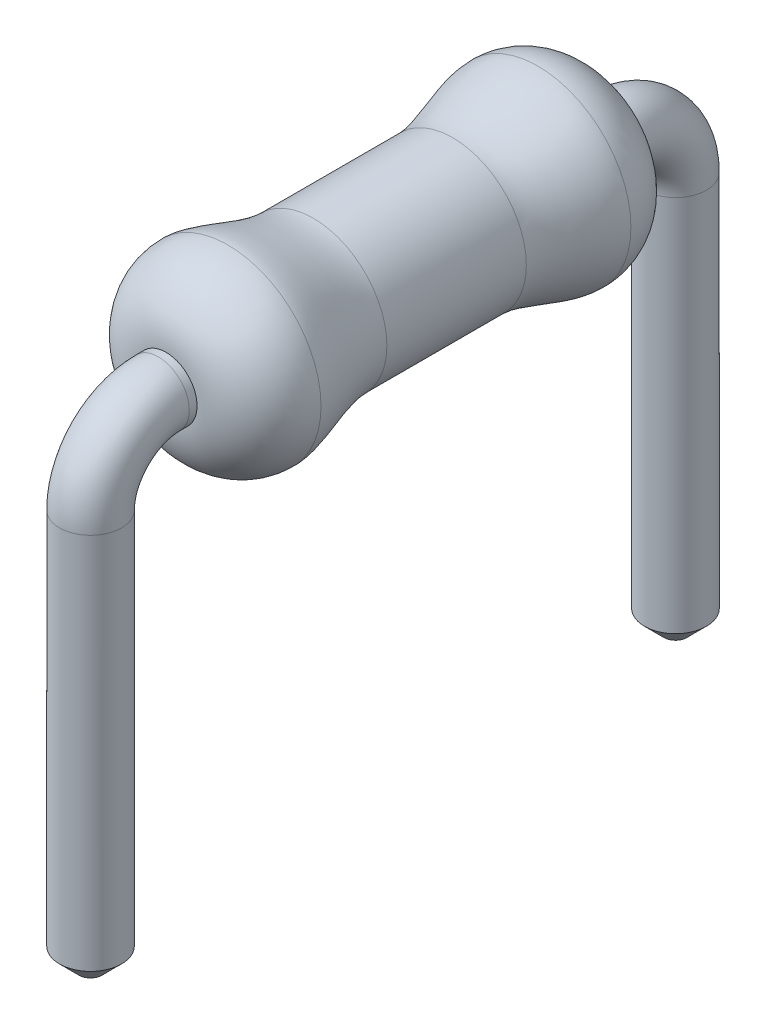
ISO-10303-21;
HEADER;
FILE_DESCRIPTION(('STEP AP214'),'2;1');
FILE_NAME('part.step','',(''),(''),'','','');
FILE_SCHEMA(('AUTOMOTIVE_DESIGN { 1 0 10303 214 1 1 1 1 }'));
ENDSEC;
DATA;
#1=APPLICATION_CONTEXT('core data for automotive mechanical design processes');
#2=APPLICATION_PROTOCOL_DEFINITION('international standard','automotive_design',2000,#1);
#3=PRODUCT_CONTEXT('',#1,'mechanical');
#4=PRODUCT('Part','Part','',(#3));
#5=PRODUCT_RELATED_PRODUCT_CATEGORY('part','',(#4));
#6=PRODUCT_DEFINITION_FORMATION('','',#4);
#7=PRODUCT_DEFINITION_CONTEXT('part definition',#1,'design');
#8=PRODUCT_DEFINITION('design','',#6,#7);
#9=PRODUCT_DEFINITION_SHAPE('','',#8);
#10=(LENGTH_UNIT() NAMED_UNIT(*) SI_UNIT(.MILLI.,.METRE.));
#11=(NAMED_UNIT(*) PLANE_ANGLE_UNIT() SI_UNIT($,.RADIAN.));
#12=(NAMED_UNIT(*) SI_UNIT($,.STERADIAN.) SOLID_ANGLE_UNIT());
#13=UNCERTAINTY_MEASURE_WITH_UNIT(LENGTH_MEASURE(1.E-05),#10,'distance_accuracy_value','');
#14=(GEOMETRIC_REPRESENTATION_CONTEXT(3) GLOBAL_UNCERTAINTY_ASSIGNED_CONTEXT((#13)) GLOBAL_UNIT_ASSIGNED_CONTEXT((#10,
#11,#12)) REPRESENTATION_CONTEXT('',''));
#15=CARTESIAN_POINT('',(0.,0.,0.));
#16=DIRECTION('',(0.,0.,1.));
#17=DIRECTION('',(1.,0.,0.));
#18=AXIS2_PLACEMENT_3D('',#15,#16,#17);
#19=CARTESIAN_POINT('',(0.,3.,-2.));
#20=DIRECTION('',(0.,0.,1.));
#21=DIRECTION('',(1.,0.,0.));
#22=AXIS2_PLACEMENT_3D('',#19,#20,#21);
#23=DEGENERATE_TOROIDAL_SURFACE('',#22,0.4,0.8,.T.);
#24=CARTESIAN_POINT('',(0.,3.,-2.));
#25=DIRECTION('',(0.,0.,1.));
#26=DIRECTION('',(1.,0.,0.));
#27=AXIS2_PLACEMENT_3D('',#24,#25,#26);
#28=CIRCLE('',#27,1.2);
#29=CARTESIAN_POINT('',(1.2,3.,-2.));
#30=VERTEX_POINT('',#29);
#31=EDGE_CURVE('E11',#30,#30,#28,.T.);
#32=ORIENTED_EDGE('',*,*,#31,.F.);
#33=EDGE_LOOP('',(#32));
#34=FACE_BOUND('',#33,.T.);
#35=CARTESIAN_POINT('',(0.,3.,-2.8));
#36=DIRECTION('',(0.,0.,1.));
#37=DIRECTION('',(1.,0.,0.));
#38=AXIS2_PLACEMENT_3D('',#35,#36,#37);
#39=CIRCLE('',#38,0.4);
#40=CARTESIAN_POINT('',(0.4,3.,-2.8));
#41=VERTEX_POINT('',#40);
#42=EDGE_CURVE('E65',#41,#41,#39,.T.);
#43=ORIENTED_EDGE('',*,*,#42,.T.);
#44=EDGE_LOOP('',(#43));
#45=FACE_BOUND('',#44,.T.);
#46=ADVANCED_FACE('F43',(#34,#45),#23,.T.);
#47=CARTESIAN_POINT('',(0.,4.2,-2.));
#48=CARTESIAN_POINT('',(0.,4.2,-1.67748928550892));
#49=CARTESIAN_POINT('',(0.,3.95,-1.22975760115089));
#50=CARTESIAN_POINT('',(0.,3.95,-0.9));
#51=B_SPLINE_CURVE_WITH_KNOTS('',3,(#47,#48,#49,#50),.UNSPECIFIED.,.F.,.F.,(4,4),(0.,1.),.UNSPECIFIED.);
#52=CARTESIAN_POINT('',(0.,3.,5.5081016462708));
#53=DIRECTION('',(0.,0.,1.));
#54=AXIS1_PLACEMENT('',#52,#53);
#55=SURFACE_OF_REVOLUTION('',#51,#54);
#56=CARTESIAN_POINT('',(0.,3.,-0.9));
#57=DIRECTION('',(0.,0.,1.));
#58=DIRECTION('',(1.,0.,0.));
#59=AXIS2_PLACEMENT_3D('',#56,#57,#58);
#60=CIRCLE('',#59,0.95);
#61=CARTESIAN_POINT('',(0.95,3.,-0.9));
#62=VERTEX_POINT('',#61);
#63=EDGE_CURVE('E49',#62,#62,#60,.T.);
#64=ORIENTED_EDGE('',*,*,#63,.F.);
#65=EDGE_LOOP('',(#64));
#66=FACE_BOUND('',#65,.T.);
#67=ORIENTED_EDGE('',*,*,#31,.T.);
#68=EDGE_LOOP('',(#67));
#69=FACE_BOUND('',#68,.T.);
#70=ADVANCED_FACE('F88',(#66,#69),#55,.T.);
#71=CARTESIAN_POINT('',(0.,3.,5.5081016462708));
#72=DIRECTION('',(0.,0.,1.));
#73=DIRECTION('',(1.,0.,0.));
#74=AXIS2_PLACEMENT_3D('',#71,#72,#73);
#75=CYLINDRICAL_SURFACE('',#74,0.95);
#76=CARTESIAN_POINT('',(0.,3.,0.9));
#77=DIRECTION('',(0.,0.,1.));
#78=DIRECTION('',(1.,0.,0.));
#79=AXIS2_PLACEMENT_3D('',#76,#77,#78);
#80=CIRCLE('',#79,0.95);
#81=CARTESIAN_POINT('',(0.95,3.,0.9));
#82=VERTEX_POINT('',#81);
#83=EDGE_CURVE('E53',#82,#82,#80,.T.);
#84=ORIENTED_EDGE('',*,*,#83,.F.);
#85=EDGE_LOOP('',(#84));
#86=FACE_BOUND('',#85,.T.);
#87=ORIENTED_EDGE('',*,*,#63,.T.);
#88=EDGE_LOOP('',(#87));
#89=FACE_BOUND('',#88,.T.);
#90=ADVANCED_FACE('F84',(#86,#89),#75,.T.);
#91=CARTESIAN_POINT('',(0.,3.95,0.9));
#92=CARTESIAN_POINT('',(0.,3.95,1.27989742926156));
#93=CARTESIAN_POINT('',(0.,4.2,1.73855323777111));
#94=CARTESIAN_POINT('',(0.,4.2,2.));
#95=B_SPLINE_CURVE_WITH_KNOTS('',3,(#91,#92,#93,#94),.UNSPECIFIED.,.F.,.F.,(4,4),(0.,1.),.UNSPECIFIED.);
#96=CARTESIAN_POINT('',(0.,3.,5.5081016462708));
#97=DIRECTION('',(0.,0.,1.));
#98=AXIS1_PLACEMENT('',#96,#97);
#99=SURFACE_OF_REVOLUTION('',#95,#98);
#100=CARTESIAN_POINT('',(0.,3.,2.));
#101=DIRECTION('',(0.,0.,1.));
#102=DIRECTION('',(1.,0.,0.));
#103=AXIS2_PLACEMENT_3D('',#100,#101,#102);
#104=CIRCLE('',#103,1.2);
#105=CARTESIAN_POINT('',(1.2,3.,2.));
#106=VERTEX_POINT('',#105);
#107=EDGE_CURVE('E57',#106,#106,#104,.T.);
#108=ORIENTED_EDGE('',*,*,#107,.F.);
#109=EDGE_LOOP('',(#108));
#110=FACE_BOUND('',#109,.T.);
#111=ORIENTED_EDGE('',*,*,#83,.T.);
#112=EDGE_LOOP('',(#111));
#113=FACE_BOUND('',#112,.T.);
#114=ADVANCED_FACE('F79',(#110,#113),#99,.T.);
#115=CARTESIAN_POINT('',(0.,3.,2.));
#116=DIRECTION('',(0.,0.,1.));
#117=DIRECTION('',(1.,0.,0.));
#118=AXIS2_PLACEMENT_3D('',#115,#116,#117);
#119=DEGENERATE_TOROIDAL_SURFACE('',#118,0.4,0.8,.T.);
#120=CARTESIAN_POINT('',(0.,3.,2.8));
#121=DIRECTION('',(0.,0.,1.));
#122=DIRECTION('',(1.,0.,0.));
#123=AXIS2_PLACEMENT_3D('',#120,#121,#122);
#124=CIRCLE('',#123,0.4);
#125=CARTESIAN_POINT('',(0.4,3.,2.8));
#126=VERTEX_POINT('',#125);
#127=EDGE_CURVE('E62',#126,#126,#124,.T.);
#128=ORIENTED_EDGE('',*,*,#127,.F.);
#129=EDGE_LOOP('',(#128));
#130=FACE_BOUND('',#129,.T.);
#131=ORIENTED_EDGE('',*,*,#107,.T.);
#132=EDGE_LOOP('',(#131));
#133=FACE_BOUND('',#132,.T.);
#134=ADVANCED_FACE('F83',(#130,#133),#119,.T.);
#135=CARTESIAN_POINT('',(0.,3.,5.5081016462708));
#136=DIRECTION('',(0.,0.,1.));
#137=DIRECTION('',(1.,0.,0.));
#138=AXIS2_PLACEMENT_3D('',#135,#136,#137);
#139=CYLINDRICAL_SURFACE('',#138,0.4);
#140=ORIENTED_EDGE('',*,*,#42,.F.);
#141=EDGE_LOOP('',(#140));
#142=FACE_BOUND('',#141,.T.);
#143=ORIENTED_EDGE('',*,*,#127,.T.);
#144=EDGE_LOOP('',(#143));
#145=FACE_BOUND('',#144,.T.);
#146=ADVANCED_FACE('F101',(#142,#145),#139,.F.);
#147=CLOSED_SHELL('',(#46,#70,#90,#114,#134,#146));
#148=MANIFOLD_SOLID_BREP('B2',#147);
#149=CARTESIAN_POINT('',(0.,-3.,-3.775));
#150=DIRECTION('',(0.,1.,0.));
#151=DIRECTION('',(0.,0.,1.));
#152=AXIS2_PLACEMENT_3D('',#149,#150,#151);
#153=PLANE('',#152);
#154=CARTESIAN_POINT('',(0.,-3.,-3.775));
#155=DIRECTION('',(0.,1.,0.));
#156=DIRECTION('',(0.,0.,1.));
#157=AXIS2_PLACEMENT_3D('',#154,#155,#156);
#158=CIRCLE('',#157,0.149999999999999);
#159=CARTESIAN_POINT('',(0.,-3.,-3.625));
#160=VERTEX_POINT('',#159);
#161=EDGE_CURVE('E160',#160,#160,#158,.F.);
#162=ORIENTED_EDGE('',*,*,#161,.T.);
#163=EDGE_LOOP('',(#162));
#164=FACE_BOUND('',#163,.T.);
#165=ADVANCED_FACE('F149',(#164),#153,.F.);
#166=CARTESIAN_POINT('',(0.,-3.,3.775));
#167=DIRECTION('',(0.,-1.,0.));
#168=DIRECTION('',(0.,0.,-1.));
#169=AXIS2_PLACEMENT_3D('',#166,#167,#168);
#170=PLANE('',#169);
#171=CARTESIAN_POINT('',(0.,-3.,3.775));
#172=DIRECTION('',(0.,-1.,0.));
#173=DIRECTION('',(0.,0.,-1.));
#174=AXIS2_PLACEMENT_3D('',#171,#172,#173);
#175=CIRCLE('',#174,0.150000000000003);
#176=CARTESIAN_POINT('',(0.,-3.,3.625));
#177=VERTEX_POINT('',#176);
#178=EDGE_CURVE('E156',#177,#177,#175,.T.);
#179=ORIENTED_EDGE('',*,*,#178,.T.);
#180=EDGE_LOOP('',(#179));
#181=FACE_BOUND('',#180,.T.);
#182=ADVANCED_FACE('F186',(#181),#170,.T.);
#183=CARTESIAN_POINT('',(0.,-3.,-3.775));
#184=DIRECTION('',(0.,1.,0.));
#185=DIRECTION('',(0.,0.,1.));
#186=AXIS2_PLACEMENT_3D('',#183,#184,#185);
#187=CYLINDRICAL_SURFACE('',#186,0.4);
#188=CARTESIAN_POINT('',(0.,-2.75,-3.775));
#189=DIRECTION('',(0.,1.,0.));
#190=DIRECTION('',(0.,0.,1.));
#191=AXIS2_PLACEMENT_3D('',#188,#189,#190);
#192=CIRCLE('',#191,0.4);
#193=CARTESIAN_POINT('',(0.,-2.75,-3.375));
#194=VERTEX_POINT('',#193);
#195=EDGE_CURVE('E164',#194,#194,#192,.T.);
#196=ORIENTED_EDGE('',*,*,#195,.T.);
#197=EDGE_LOOP('',(#196));
#198=FACE_BOUND('',#197,.T.);
#199=CARTESIAN_POINT('',(0.,2.125,-3.775));
#200=DIRECTION('',(0.,1.,0.));
#201=DIRECTION('',(0.,0.,1.));
#202=AXIS2_PLACEMENT_3D('',#199,#200,#201);
#203=CIRCLE('',#202,0.4);
#204=CARTESIAN_POINT('',(0.,2.125,-4.175));
#205=VERTEX_POINT('',#204);
#206=EDGE_CURVE('E178',#205,#205,#203,.T.);
#207=ORIENTED_EDGE('',*,*,#206,.F.);
#208=EDGE_LOOP('',(#207));
#209=FACE_BOUND('',#208,.T.);
#210=ADVANCED_FACE('F184',(#198,#209),#187,.T.);
#211=CARTESIAN_POINT('',(0.,2.125,-2.9));
#212=DIRECTION('',(1.,0.,0.));
#213=DIRECTION('',(0.,0.,-1.));
#214=AXIS2_PLACEMENT_3D('',#211,#212,#213);
#215=TOROIDAL_SURFACE('',#214,0.875,0.4);
#216=CARTESIAN_POINT('',(0.,3.,-2.9));
#217=DIRECTION('',(0.,0.,1.));
#218=DIRECTION('',(0.,-1.,0.));
#219=AXIS2_PLACEMENT_3D('',#216,#217,#218);
#220=CIRCLE('',#219,0.4);
#221=CARTESIAN_POINT('',(0.,3.4,-2.9));
#222=VERTEX_POINT('',#221);
#223=EDGE_CURVE('E175',#222,#222,#220,.T.);
#224=CARTESIAN_POINT('',(0.,2.125,-2.9));
#225=DIRECTION('',(1.,0.,0.));
#226=DIRECTION('',(0.,0.,-1.));
#227=AXIS2_PLACEMENT_3D('',#224,#225,#226);
#228=CIRCLE('',#227,1.275);
#229=EDGE_CURVE('',#205,#222,#228,.T.);
#230=ORIENTED_EDGE('',*,*,#206,.T.);
#231=ORIENTED_EDGE('',*,*,#223,.F.);
#232=ORIENTED_EDGE('',*,*,#229,.T.);
#233=ORIENTED_EDGE('',*,*,#229,.F.);
#234=EDGE_LOOP('',(#230,#232,#231,#233));
#235=FACE_BOUND('',#234,.T.);
#236=ADVANCED_FACE('F182',(#235),#215,.T.);
#237=CARTESIAN_POINT('',(0.,3.,-2.9));
#238=DIRECTION('',(0.,0.,1.));
#239=DIRECTION('',(1.,0.,0.));
#240=AXIS2_PLACEMENT_3D('',#237,#238,#239);
#241=CYLINDRICAL_SURFACE('',#240,0.4);
#242=CARTESIAN_POINT('',(0.,3.,2.9));
#243=DIRECTION('',(0.,0.,1.));
#244=DIRECTION('',(0.,-1.,0.));
#245=AXIS2_PLACEMENT_3D('',#242,#243,#244);
#246=CIRCLE('',#245,0.4);
#247=CARTESIAN_POINT('',(0.,3.4,2.9));
#248=VERTEX_POINT('',#247);
#249=EDGE_CURVE('E172',#248,#248,#246,.T.);
#250=ORIENTED_EDGE('',*,*,#249,.F.);
#251=EDGE_LOOP('',(#250));
#252=FACE_BOUND('',#251,.T.);
#253=ORIENTED_EDGE('',*,*,#223,.T.);
#254=EDGE_LOOP('',(#253));
#255=FACE_BOUND('',#254,.T.);
#256=ADVANCED_FACE('F193',(#252,#255),#241,.T.);
#257=CARTESIAN_POINT('',(0.,2.125,2.9));
#258=DIRECTION('',(1.,0.,0.));
#259=DIRECTION('',(0.,0.,-1.));
#260=AXIS2_PLACEMENT_3D('',#257,#258,#259);
#261=TOROIDAL_SURFACE('',#260,0.875,0.4);
#262=CARTESIAN_POINT('',(0.,2.125,3.775));
#263=DIRECTION('',(0.,-1.,0.));
#264=DIRECTION('',(0.,0.,-1.));
#265=AXIS2_PLACEMENT_3D('',#262,#263,#264);
#266=CIRCLE('',#265,0.4);
#267=CARTESIAN_POINT('',(0.,2.125,4.175));
#268=VERTEX_POINT('',#267);
#269=EDGE_CURVE('E169',#268,#268,#266,.T.);
#270=CARTESIAN_POINT('',(0.,2.125,2.9));
#271=DIRECTION('',(1.,0.,0.));
#272=DIRECTION('',(0.,0.,-1.));
#273=AXIS2_PLACEMENT_3D('',#270,#271,#272);
#274=CIRCLE('',#273,1.275);
#275=EDGE_CURVE('',#248,#268,#274,.T.);
#276=ORIENTED_EDGE('',*,*,#249,.T.);
#277=ORIENTED_EDGE('',*,*,#269,.F.);
#278=ORIENTED_EDGE('',*,*,#275,.T.);
#279=ORIENTED_EDGE('',*,*,#275,.F.);
#280=EDGE_LOOP('',(#276,#278,#277,#279));
#281=FACE_BOUND('',#280,.T.);
#282=ADVANCED_FACE('F200',(#281),#261,.T.);
#283=CARTESIAN_POINT('',(0.,2.125,3.775));
#284=DIRECTION('',(0.,-1.,0.));
#285=DIRECTION('',(0.,0.,-1.));
#286=AXIS2_PLACEMENT_3D('',#283,#284,#285);
#287=CYLINDRICAL_SURFACE('',#286,0.4);
#288=CARTESIAN_POINT('',(0.,-2.75,3.775));
#289=DIRECTION('',(0.,-1.,0.));
#290=DIRECTION('',(0.,0.,-1.));
#291=AXIS2_PLACEMENT_3D('',#288,#289,#290);
#292=CIRCLE('',#291,0.4);
#293=CARTESIAN_POINT('',(0.,-2.75,3.375));
#294=VERTEX_POINT('',#293);
#295=EDGE_CURVE('E42',#294,#294,#292,.F.);
#296=ORIENTED_EDGE('',*,*,#295,.T.);
#297=EDGE_LOOP('',(#296));
#298=FACE_BOUND('',#297,.T.);
#299=ORIENTED_EDGE('',*,*,#269,.T.);
#300=EDGE_LOOP('',(#299));
#301=FACE_BOUND('',#300,.T.);
#302=ADVANCED_FACE('F197',(#298,#301),#287,.T.);
#303=CARTESIAN_POINT('',(0.,-2.75,-3.775));
#304=DIRECTION('',(0.,1.,0.));
#305=DIRECTION('',(0.,0.,1.));
#306=AXIS2_PLACEMENT_3D('',#303,#304,#305);
#307=CONICAL_SURFACE('',#306,0.4,0.78539816339745);
#308=ORIENTED_EDGE('',*,*,#161,.F.);
#309=EDGE_LOOP('',(#308));
#310=FACE_BOUND('',#309,.T.);
#311=ORIENTED_EDGE('',*,*,#195,.F.);
#312=EDGE_LOOP('',(#311));
#313=FACE_BOUND('',#312,.T.);
#314=ADVANCED_FACE('F199',(#310,#313),#307,.T.);
#315=CARTESIAN_POINT('',(0.,-3.,3.775));
#316=DIRECTION('',(0.,1.,0.));
#317=DIRECTION('',(0.,0.,1.));
#318=AXIS2_PLACEMENT_3D('',#315,#316,#317);
#319=CONICAL_SURFACE('',#318,0.150000000000003,0.785398163397445);
#320=ORIENTED_EDGE('',*,*,#295,.F.);
#321=EDGE_LOOP('',(#320));
#322=FACE_BOUND('',#321,.T.);
#323=ORIENTED_EDGE('',*,*,#178,.F.);
#324=EDGE_LOOP('',(#323));
#325=FACE_BOUND('',#324,.T.);
#326=ADVANCED_FACE('F151',(#322,#325),#319,.T.);
#327=CLOSED_SHELL('',(#165,#182,#210,#236,#256,#282,#302,#314,#326));
#328=MANIFOLD_SOLID_BREP('B6',#327);
#329=ADVANCED_BREP_SHAPE_REPRESENTATION('',(#18,#148,#328),#14);
#330=SHAPE_DEFINITION_REPRESENTATION(#9,#329);
ENDSEC;
END-ISO-10303-21;
